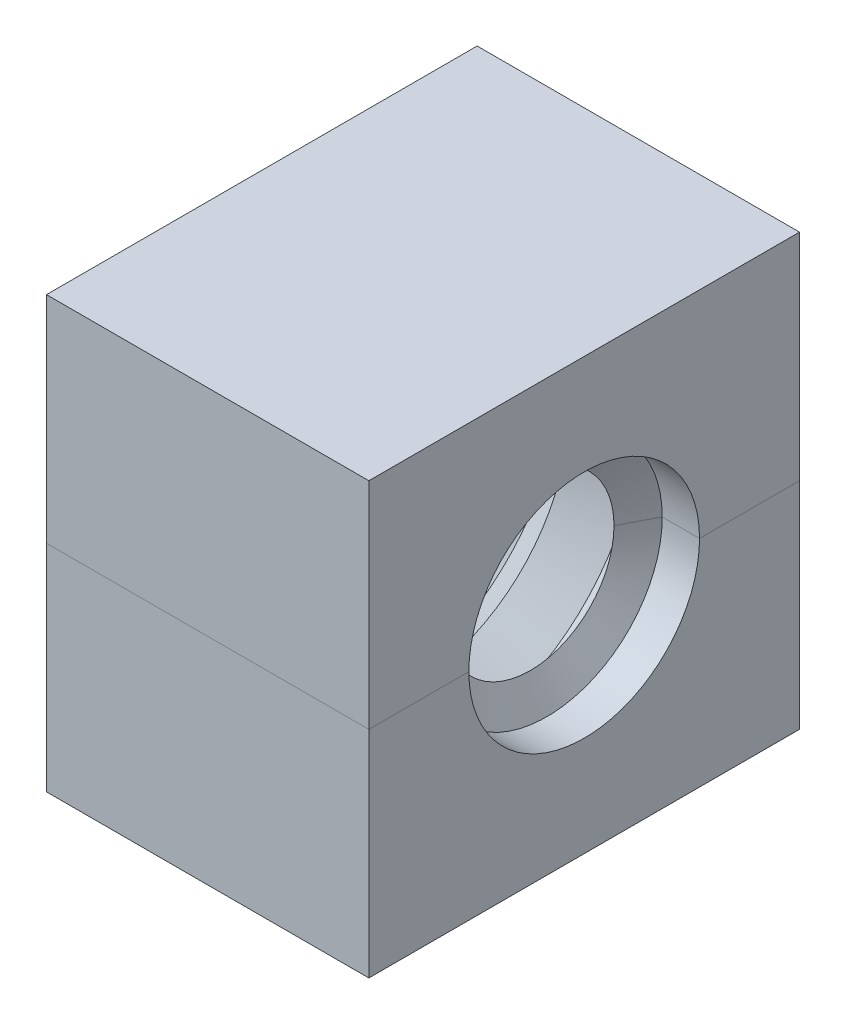
ISO-10303-21;
HEADER;
FILE_DESCRIPTION(('STEP AP214'),'2;1');
FILE_NAME('part.step','',(''),(''),'','','');
FILE_SCHEMA(('AUTOMOTIVE_DESIGN { 1 0 10303 214 1 1 1 1 }'));
ENDSEC;
DATA;
#1=APPLICATION_CONTEXT('core data for automotive mechanical design processes');
#2=APPLICATION_PROTOCOL_DEFINITION('international standard','automotive_design',2000,#1);
#3=PRODUCT_CONTEXT('',#1,'mechanical');
#4=PRODUCT('Part','Part','',(#3));
#5=PRODUCT_RELATED_PRODUCT_CATEGORY('part','',(#4));
#6=PRODUCT_DEFINITION_FORMATION('','',#4);
#7=PRODUCT_DEFINITION_CONTEXT('part definition',#1,'design');
#8=PRODUCT_DEFINITION('design','',#6,#7);
#9=PRODUCT_DEFINITION_SHAPE('','',#8);
#10=(LENGTH_UNIT() NAMED_UNIT(*) SI_UNIT(.MILLI.,.METRE.));
#11=(NAMED_UNIT(*) PLANE_ANGLE_UNIT() SI_UNIT($,.RADIAN.));
#12=(NAMED_UNIT(*) SI_UNIT($,.STERADIAN.) SOLID_ANGLE_UNIT());
#13=UNCERTAINTY_MEASURE_WITH_UNIT(LENGTH_MEASURE(1.E-05),#10,'distance_accuracy_value','');
#14=(GEOMETRIC_REPRESENTATION_CONTEXT(3) GLOBAL_UNCERTAINTY_ASSIGNED_CONTEXT((#13)) GLOBAL_UNIT_ASSIGNED_CONTEXT((#10,
#11,#12)) REPRESENTATION_CONTEXT('',''));
#15=CARTESIAN_POINT('',(0.,0.,0.));
#16=DIRECTION('',(0.,0.,1.));
#17=DIRECTION('',(1.,0.,0.));
#18=AXIS2_PLACEMENT_3D('',#15,#16,#17);
#19=CARTESIAN_POINT('',(0.,-12.7363589291602,0.));
#20=DIRECTION('',(0.,1.,0.));
#21=DIRECTION('',(0.,0.,1.));
#22=AXIS2_PLACEMENT_3D('',#19,#20,#21);
#23=PLANE('',#22);
#24=DIRECTION('',(1.,0.,0.));
#25=VECTOR('',#24,1.);
#26=CARTESIAN_POINT('',(7.7590975124216,-12.7363589291602,-15.));
#27=LINE('',#26,#25);
#28=CARTESIAN_POINT('',(-4.98108073090918,-12.7363589291602,-15.));
#29=VERTEX_POINT('',#28);
#30=CARTESIAN_POINT('',(-9.83041243256664,-12.7363589291602,-15.));
#31=VERTEX_POINT('',#30);
#32=EDGE_CURVE('E215',#29,#31,#27,.F.);
#33=ORIENTED_EDGE('',*,*,#32,.F.);
#34=DIRECTION('',(0.,0.,-1.));
#35=VECTOR('',#34,1.);
#36=CARTESIAN_POINT('',(-4.98108073090918,-12.7363589291602,0.));
#37=LINE('',#36,#35);
#38=CARTESIAN_POINT('',(-4.98108073090918,-12.7363589291602,-28.));
#39=VERTEX_POINT('',#38);
#40=EDGE_CURVE('E168',#29,#39,#37,.T.);
#41=ORIENTED_EDGE('',*,*,#40,.T.);
#42=DIRECTION('',(1.,0.,0.));
#43=VECTOR('',#42,1.);
#44=CARTESIAN_POINT('',(-50.,-12.7363589291602,-28.));
#45=LINE('',#44,#43);
#46=CARTESIAN_POINT('',(-46.9,-12.7363589291602,-28.));
#47=VERTEX_POINT('',#46);
#48=EDGE_CURVE('E167',#47,#39,#45,.T.);
#49=ORIENTED_EDGE('',*,*,#48,.F.);
#50=DIRECTION('',(0.,0.,1.));
#51=VECTOR('',#50,1.);
#52=CARTESIAN_POINT('',(-46.9,-12.7363589291602,5.91789546218049));
#53=LINE('',#52,#51);
#54=CARTESIAN_POINT('',(-46.9,-12.7363589291602,-25.));
#55=VERTEX_POINT('',#54);
#56=EDGE_CURVE('E148',#47,#55,#53,.T.);
#57=ORIENTED_EDGE('',*,*,#56,.T.);
#58=DIRECTION('',(1.,0.,0.));
#59=VECTOR('',#58,1.);
#60=CARTESIAN_POINT('',(7.7590975124216,-12.7363589291602,-25.));
#61=LINE('',#60,#59);
#62=CARTESIAN_POINT('',(-42.6897877664927,-12.7363589291603,-25.));
#63=VERTEX_POINT('',#62);
#64=EDGE_CURVE('E154',#63,#55,#61,.F.);
#65=ORIENTED_EDGE('',*,*,#64,.F.);
#66=DIRECTION('',(-0.757802500204729,0.,-0.652484000327565));
#67=VECTOR('',#66,1.);
#68=CARTESIAN_POINT('',(-13.6544972526912,-12.7363589291602,0.));
#69=LINE('',#68,#67);
#70=CARTESIAN_POINT('',(-37.6897877664927,-12.7363589291602,-20.6948941171922));
#71=VERTEX_POINT('',#70);
#72=EDGE_CURVE('E257',#71,#63,#69,.T.);
#73=ORIENTED_EDGE('',*,*,#72,.F.);
#74=DIRECTION('',(-0.757802500204728,0.,0.652484000327566));
#75=VECTOR('',#74,1.);
#76=CARTESIAN_POINT('',(-61.7250782802942,-12.7363589291602,0.));
#77=LINE('',#76,#75);
#78=CARTESIAN_POINT('',(-32.6897877664927,-12.7363589291602,-25.));
#79=VERTEX_POINT('',#78);
#80=EDGE_CURVE('E259',#79,#71,#77,.T.);
#81=ORIENTED_EDGE('',*,*,#80,.F.);
#82=DIRECTION('',(-0.757802500204728,0.,-0.652484000327566));
#83=VECTOR('',#82,1.);
#84=CARTESIAN_POINT('',(-3.65449725269126,-12.7363589291602,0.));
#85=LINE('',#84,#83);
#86=CARTESIAN_POINT('',(-27.6897877664927,-12.7363589291602,-20.6948941171922));
#87=VERTEX_POINT('',#86);
#88=EDGE_CURVE('E266',#87,#79,#85,.T.);
#89=ORIENTED_EDGE('',*,*,#88,.F.);
#90=DIRECTION('',(-0.757802500204728,0.,0.652484000327566));
#91=VECTOR('',#90,1.);
#92=CARTESIAN_POINT('',(-51.7250782802941,-12.7363589291602,0.));
#93=LINE('',#92,#91);
#94=CARTESIAN_POINT('',(-22.6897877664927,-12.7363589291602,-25.));
#95=VERTEX_POINT('',#94);
#96=EDGE_CURVE('E269',#95,#87,#93,.T.);
#97=ORIENTED_EDGE('',*,*,#96,.F.);
#98=CARTESIAN_POINT('',(-22.6897877664927,-12.7363589291602,-25.));
#99=CARTESIAN_POINT('',(-19.9348326579527,-12.7363589291602,-24.0792000683215));
#100=CARTESIAN_POINT('',(-17.4436232589525,-12.7363589291602,-22.4393096665836));
#101=CARTESIAN_POINT('',(-13.9498380100244,-12.7363589291602,-16.5030001450915));
#102=CARTESIAN_POINT('',(-13.2180776216996,-12.7363589291602,-15.5349248227247));
#103=CARTESIAN_POINT('',(-11.9810807309092,-12.7363589291602,-10.8777948967174));
#104=B_SPLINE_CURVE_WITH_KNOTS('',3,(#98,#99,#100,#101,#102,#103),.UNSPECIFIED.,.F.,.F.,(4,1,1,
4),(0.,0.4140263855918,0.5140263855918,1.),.UNSPECIFIED.);
#105=CARTESIAN_POINT('',(-11.9810807309092,-12.7363589291602,-10.8777948967174));
#106=VERTEX_POINT('',#105);
#107=EDGE_CURVE('E220',#106,#95,#104,.F.);
#108=ORIENTED_EDGE('',*,*,#107,.F.);
#109=DIRECTION('',(-0.462557992065755,0.,0.886589027665071));
#110=VECTOR('',#109,1.);
#111=CARTESIAN_POINT('',(-17.6563268805034,-12.7363589291602,0.));
#112=LINE('',#111,#110);
#113=EDGE_CURVE('E207',#31,#106,#112,.T.);
#114=ORIENTED_EDGE('',*,*,#113,.F.);
#115=EDGE_LOOP('',(#33,#41,#49,#57,#65,#73,#81,#89,#97,#108,#114));
#116=FACE_BOUND('',#115,.T.);
#117=ADVANCED_FACE('F44',(#116),#23,.T.);
#118=DIRECTION('',(1.,0.,0.));
#119=VECTOR('',#118,1.);
#120=CARTESIAN_POINT('',(7.7590975124216,-12.7363589291602,15.));
#121=LINE('',#120,#119);
#122=CARTESIAN_POINT('',(-9.83041243256664,-12.7363589291602,15.));
#123=VERTEX_POINT('',#122);
#124=CARTESIAN_POINT('',(-4.98108073090918,-12.7363589291602,15.));
#125=VERTEX_POINT('',#124);
#126=EDGE_CURVE('E213',#123,#125,#121,.T.);
#127=ORIENTED_EDGE('',*,*,#126,.F.);
#128=DIRECTION('',(0.462557992065755,0.,0.886589027665071));
#129=VECTOR('',#128,1.);
#130=CARTESIAN_POINT('',(-17.6563268805034,-12.7363589291602,0.));
#131=LINE('',#130,#129);
#132=CARTESIAN_POINT('',(-11.9810807309092,-12.7363589291602,10.8777948967174));
#133=VERTEX_POINT('',#132);
#134=EDGE_CURVE('E209',#133,#123,#131,.T.);
#135=ORIENTED_EDGE('',*,*,#134,.F.);
#136=CARTESIAN_POINT('',(-22.6897877664927,-12.7363589291602,25.));
#137=CARTESIAN_POINT('',(-19.9348326579527,-12.7363589291602,24.0792000683215));
#138=CARTESIAN_POINT('',(-17.4436232589525,-12.7363589291602,22.4393096665836));
#139=CARTESIAN_POINT('',(-13.9498380100244,-12.7363589291602,16.5030001450915));
#140=CARTESIAN_POINT('',(-13.2180776216996,-12.7363589291602,15.5349248227247));
#141=CARTESIAN_POINT('',(-11.9810807309092,-12.7363589291602,10.8777948967174));
#142=B_SPLINE_CURVE_WITH_KNOTS('',3,(#136,#137,#138,#139,#140,#141),.UNSPECIFIED.,.F.,.F.,(4,1,
1,4),(0.,0.4140263855918,0.5140263855918,1.),.UNSPECIFIED.);
#143=CARTESIAN_POINT('',(-22.6897877664927,-12.7363589291602,25.));
#144=VERTEX_POINT('',#143);
#145=EDGE_CURVE('E227',#144,#133,#142,.T.);
#146=ORIENTED_EDGE('',*,*,#145,.F.);
#147=DIRECTION('',(0.757802500204728,0.,0.652484000327566));
#148=VECTOR('',#147,1.);
#149=CARTESIAN_POINT('',(-51.7250782802941,-12.7363589291602,0.));
#150=LINE('',#149,#148);
#151=CARTESIAN_POINT('',(-27.6897877664927,-12.7363589291602,20.6948941171922));
#152=VERTEX_POINT('',#151);
#153=EDGE_CURVE('E272',#152,#144,#150,.T.);
#154=ORIENTED_EDGE('',*,*,#153,.F.);
#155=DIRECTION('',(0.757802500204728,0.,-0.652484000327566));
#156=VECTOR('',#155,1.);
#157=CARTESIAN_POINT('',(-3.65449725269126,-12.7363589291602,0.));
#158=LINE('',#157,#156);
#159=CARTESIAN_POINT('',(-32.6897877664927,-12.7363589291602,25.));
#160=VERTEX_POINT('',#159);
#161=EDGE_CURVE('E264',#160,#152,#158,.T.);
#162=ORIENTED_EDGE('',*,*,#161,.F.);
#163=DIRECTION('',(0.757802500204728,0.,0.652484000327566));
#164=VECTOR('',#163,1.);
#165=CARTESIAN_POINT('',(-61.7250782802942,-12.7363589291602,0.));
#166=LINE('',#165,#164);
#167=CARTESIAN_POINT('',(-37.6897877664927,-12.7363589291602,20.6948941171922));
#168=VERTEX_POINT('',#167);
#169=EDGE_CURVE('E262',#168,#160,#166,.T.);
#170=ORIENTED_EDGE('',*,*,#169,.F.);
#171=DIRECTION('',(0.757802500204729,0.,-0.652484000327565));
#172=VECTOR('',#171,1.);
#173=CARTESIAN_POINT('',(-13.6544972526912,-12.7363589291602,0.));
#174=LINE('',#173,#172);
#175=CARTESIAN_POINT('',(-42.6897877664927,-12.7363589291603,25.));
#176=VERTEX_POINT('',#175);
#177=EDGE_CURVE('E255',#176,#168,#174,.T.);
#178=ORIENTED_EDGE('',*,*,#177,.F.);
#179=DIRECTION('',(1.,0.,0.));
#180=VECTOR('',#179,1.);
#181=CARTESIAN_POINT('',(7.7590975124216,-12.7363589291602,25.));
#182=LINE('',#181,#180);
#183=CARTESIAN_POINT('',(-46.9,-12.7363589291602,25.));
#184=VERTEX_POINT('',#183);
#185=EDGE_CURVE('E162',#184,#176,#182,.T.);
#186=ORIENTED_EDGE('',*,*,#185,.F.);
#187=CARTESIAN_POINT('',(-46.9,-12.7363589291602,28.));
#188=VERTEX_POINT('',#187);
#189=EDGE_CURVE('E150',#184,#188,#53,.T.);
#190=ORIENTED_EDGE('',*,*,#189,.T.);
#191=DIRECTION('',(-1.,0.,0.));
#192=VECTOR('',#191,1.);
#193=CARTESIAN_POINT('',(-50.,-12.7363589291602,28.));
#194=LINE('',#193,#192);
#195=CARTESIAN_POINT('',(-4.98108073090918,-12.7363589291602,28.));
#196=VERTEX_POINT('',#195);
#197=EDGE_CURVE('E217',#196,#188,#194,.T.);
#198=ORIENTED_EDGE('',*,*,#197,.F.);
#199=EDGE_CURVE('E170',#196,#125,#37,.T.);
#200=ORIENTED_EDGE('',*,*,#199,.T.);
#201=EDGE_LOOP('',(#127,#135,#146,#154,#162,#170,#178,#186,#190,#198,#200));
#202=FACE_BOUND('',#201,.T.);
#203=ADVANCED_FACE('F241',(#202),#23,.T.);
#204=CARTESIAN_POINT('',(-22.6897877664927,-37.7363589291602,0.));
#205=CARTESIAN_POINT('',(-19.9348326579527,-36.8155589974817,0.));
#206=CARTESIAN_POINT('',(-17.4436232589525,-35.1756685957439,0.));
#207=CARTESIAN_POINT('',(-13.9498380100244,-29.2393590742518,0.));
#208=CARTESIAN_POINT('',(-13.2180776216996,-28.271283751885,0.));
#209=CARTESIAN_POINT('',(-11.9810807309092,-23.6141538258777,0.));
#210=B_SPLINE_CURVE_WITH_KNOTS('',3,(#204,#205,#206,#207,#208,#209),.UNSPECIFIED.,.F.,.F.,(4,1,
1,4),(0.,0.4140263855918,0.5140263855918,1.),.UNSPECIFIED.);
#211=CARTESIAN_POINT('',(7.7590975124216,-12.7363589291602,0.));
#212=DIRECTION('',(1.,0.,0.));
#213=AXIS1_PLACEMENT('',#211,#212);
#214=SURFACE_OF_REVOLUTION('',#210,#213);
#215=CARTESIAN_POINT('',(-22.6897877664927,-12.7363589291602,0.));
#216=DIRECTION('',(1.,0.,0.));
#217=DIRECTION('',(0.,1.,0.));
#218=AXIS2_PLACEMENT_3D('',#215,#216,#217);
#219=CIRCLE('',#218,25.);
#220=EDGE_CURVE('E194',#144,#95,#219,.T.);
#221=ORIENTED_EDGE('',*,*,#220,.F.);
#222=ORIENTED_EDGE('',*,*,#145,.T.);
#223=CARTESIAN_POINT('',(-11.9810807309092,-12.7363589291602,0.));
#224=DIRECTION('',(1.,0.,0.));
#225=DIRECTION('',(0.,1.,0.));
#226=AXIS2_PLACEMENT_3D('',#223,#224,#225);
#227=CIRCLE('',#226,10.8777948967174);
#228=EDGE_CURVE('E197',#133,#106,#227,.T.);
#229=ORIENTED_EDGE('',*,*,#228,.T.);
#230=ORIENTED_EDGE('',*,*,#107,.T.);
#231=EDGE_LOOP('',(#221,#222,#229,#230));
#232=FACE_BOUND('',#231,.T.);
#233=ADVANCED_FACE('F286',(#232),#214,.F.);
#234=CARTESIAN_POINT('',(-27.6897877664927,-12.7363589291602,0.));
#235=DIRECTION('',(1.,0.,0.));
#236=DIRECTION('',(0.,1.,0.));
#237=AXIS2_PLACEMENT_3D('',#234,#235,#236);
#238=CONICAL_SURFACE('',#237,20.6948941171922,0.71085772924938);
#239=CARTESIAN_POINT('',(-27.6897877664927,-12.7363589291602,0.));
#240=DIRECTION('',(1.,0.,0.));
#241=DIRECTION('',(0.,1.,0.));
#242=AXIS2_PLACEMENT_3D('',#239,#240,#241);
#243=CIRCLE('',#242,20.6948941171922);
#244=EDGE_CURVE('E191',#152,#87,#243,.T.);
#245=ORIENTED_EDGE('',*,*,#244,.F.);
#246=ORIENTED_EDGE('',*,*,#153,.T.);
#247=ORIENTED_EDGE('',*,*,#220,.T.);
#248=ORIENTED_EDGE('',*,*,#96,.T.);
#249=EDGE_LOOP('',(#245,#246,#247,#248));
#250=FACE_BOUND('',#249,.T.);
#251=ADVANCED_FACE('F288',(#250),#238,.F.);
#252=CARTESIAN_POINT('',(-32.6897877664927,-12.7363589291602,0.));
#253=DIRECTION('',(-1.,0.,0.));
#254=DIRECTION('',(0.,-1.,0.));
#255=AXIS2_PLACEMENT_3D('',#252,#253,#254);
#256=CONICAL_SURFACE('',#255,25.,0.71085772924938);
#257=ORIENTED_EDGE('',*,*,#244,.T.);
#258=ORIENTED_EDGE('',*,*,#88,.T.);
#259=CARTESIAN_POINT('',(-32.6897877664927,-12.7363589291602,0.));
#260=DIRECTION('',(1.,0.,0.));
#261=DIRECTION('',(0.,1.,0.));
#262=AXIS2_PLACEMENT_3D('',#259,#260,#261);
#263=CIRCLE('',#262,25.);
#264=EDGE_CURVE('E188',#160,#79,#263,.T.);
#265=ORIENTED_EDGE('',*,*,#264,.F.);
#266=ORIENTED_EDGE('',*,*,#161,.T.);
#267=EDGE_LOOP('',(#257,#258,#265,#266));
#268=FACE_BOUND('',#267,.T.);
#269=ADVANCED_FACE('F294',(#268),#256,.F.);
#270=CARTESIAN_POINT('',(-37.6897877664927,-12.7363589291602,0.));
#271=DIRECTION('',(1.,0.,0.));
#272=DIRECTION('',(0.,1.,0.));
#273=AXIS2_PLACEMENT_3D('',#270,#271,#272);
#274=CONICAL_SURFACE('',#273,20.6948941171922,0.710857729249379);
#275=CARTESIAN_POINT('',(-37.6897877664927,-12.7363589291602,0.));
#276=DIRECTION('',(1.,0.,0.));
#277=DIRECTION('',(0.,1.,0.));
#278=AXIS2_PLACEMENT_3D('',#275,#276,#277);
#279=CIRCLE('',#278,20.6948941171922);
#280=EDGE_CURVE('E185',#168,#71,#279,.T.);
#281=ORIENTED_EDGE('',*,*,#280,.F.);
#282=ORIENTED_EDGE('',*,*,#169,.T.);
#283=ORIENTED_EDGE('',*,*,#264,.T.);
#284=ORIENTED_EDGE('',*,*,#80,.T.);
#285=EDGE_LOOP('',(#281,#282,#283,#284));
#286=FACE_BOUND('',#285,.T.);
#287=ADVANCED_FACE('F301',(#286),#274,.F.);
#288=CARTESIAN_POINT('',(-42.6897877664927,-12.7363589291603,0.));
#289=DIRECTION('',(-1.,0.,0.));
#290=DIRECTION('',(0.,-1.,0.));
#291=AXIS2_PLACEMENT_3D('',#288,#289,#290);
#292=CONICAL_SURFACE('',#291,25.,0.710857729249379);
#293=ORIENTED_EDGE('',*,*,#280,.T.);
#294=ORIENTED_EDGE('',*,*,#72,.T.);
#295=CARTESIAN_POINT('',(-42.6897877664927,-12.7363589291603,0.));
#296=DIRECTION('',(1.,0.,0.));
#297=DIRECTION('',(0.,1.,0.));
#298=AXIS2_PLACEMENT_3D('',#295,#296,#297);
#299=CIRCLE('',#298,25.);
#300=EDGE_CURVE('E159',#176,#63,#299,.T.);
#301=ORIENTED_EDGE('',*,*,#300,.F.);
#302=ORIENTED_EDGE('',*,*,#177,.T.);
#303=EDGE_LOOP('',(#293,#294,#301,#302));
#304=FACE_BOUND('',#303,.T.);
#305=ADVANCED_FACE('F305',(#304),#292,.F.);
#306=CARTESIAN_POINT('',(7.7590975124216,-12.7363589291602,0.));
#307=DIRECTION('',(1.,0.,0.));
#308=DIRECTION('',(0.,1.,0.));
#309=AXIS2_PLACEMENT_3D('',#306,#307,#308);
#310=CYLINDRICAL_SURFACE('',#309,25.);
#311=CARTESIAN_POINT('',(-46.9,-12.7363589291603,0.));
#312=DIRECTION('',(1.,0.,0.));
#313=DIRECTION('',(0.,0.,-1.));
#314=AXIS2_PLACEMENT_3D('',#311,#312,#313);
#315=CIRCLE('',#314,25.);
#316=EDGE_CURVE('E144',#184,#55,#315,.T.);
#317=ORIENTED_EDGE('',*,*,#316,.F.);
#318=ORIENTED_EDGE('',*,*,#185,.T.);
#319=ORIENTED_EDGE('',*,*,#300,.T.);
#320=ORIENTED_EDGE('',*,*,#64,.T.);
#321=EDGE_LOOP('',(#317,#318,#319,#320));
#322=FACE_BOUND('',#321,.T.);
#323=ADVANCED_FACE('F157',(#322),#310,.F.);
#324=CARTESIAN_POINT('',(-50.,15.2636410708398,28.));
#325=DIRECTION('',(0.,0.,1.));
#326=DIRECTION('',(0.,-1.,0.));
#327=AXIS2_PLACEMENT_3D('',#324,#325,#326);
#328=PLANE('',#327);
#329=DIRECTION('',(0.,-1.,0.));
#330=VECTOR('',#329,1.);
#331=CARTESIAN_POINT('',(-4.98108073090918,15.2636410708398,28.));
#332=LINE('',#331,#330);
#333=CARTESIAN_POINT('',(-4.98108073090917,-40.7363589291602,28.));
#334=VERTEX_POINT('',#333);
#335=EDGE_CURVE('E62',#196,#334,#332,.T.);
#336=ORIENTED_EDGE('',*,*,#335,.F.);
#337=ORIENTED_EDGE('',*,*,#197,.T.);
#338=DIRECTION('',(0.,1.,0.));
#339=VECTOR('',#338,1.);
#340=CARTESIAN_POINT('',(-46.9,15.2636410708398,28.));
#341=LINE('',#340,#339);
#342=CARTESIAN_POINT('',(-46.9,-40.7363589291602,28.));
#343=VERTEX_POINT('',#342);
#344=EDGE_CURVE('E176',#343,#188,#341,.T.);
#345=ORIENTED_EDGE('',*,*,#344,.F.);
#346=DIRECTION('',(1.,0.,0.));
#347=VECTOR('',#346,1.);
#348=CARTESIAN_POINT('',(-50.,-40.7363589291602,28.));
#349=LINE('',#348,#347);
#350=EDGE_CURVE('E178',#343,#334,#349,.T.);
#351=ORIENTED_EDGE('',*,*,#350,.T.);
#352=EDGE_LOOP('',(#336,#337,#345,#351));
#353=FACE_BOUND('',#352,.T.);
#354=ADVANCED_FACE('F244',(#353),#328,.T.);
#355=CARTESIAN_POINT('',(-50.,-40.7363589291602,28.));
#356=DIRECTION('',(0.,-1.,0.));
#357=DIRECTION('',(0.,0.,-1.));
#358=AXIS2_PLACEMENT_3D('',#355,#356,#357);
#359=PLANE('',#358);
#360=DIRECTION('',(0.,0.,1.));
#361=VECTOR('',#360,1.);
#362=CARTESIAN_POINT('',(-46.9,-40.7363589291602,28.));
#363=LINE('',#362,#361);
#364=CARTESIAN_POINT('',(-46.9,-40.7363589291602,-28.));
#365=VERTEX_POINT('',#364);
#366=EDGE_CURVE('E175',#365,#343,#363,.T.);
#367=ORIENTED_EDGE('',*,*,#366,.F.);
#368=DIRECTION('',(1.,0.,0.));
#369=VECTOR('',#368,1.);
#370=CARTESIAN_POINT('',(-50.,-40.7363589291602,-28.));
#371=LINE('',#370,#369);
#372=CARTESIAN_POINT('',(-4.98108073090917,-40.7363589291602,-28.));
#373=VERTEX_POINT('',#372);
#374=EDGE_CURVE('E70',#365,#373,#371,.T.);
#375=ORIENTED_EDGE('',*,*,#374,.T.);
#376=DIRECTION('',(0.,0.,-1.));
#377=VECTOR('',#376,1.);
#378=CARTESIAN_POINT('',(-4.98108073090917,-40.7363589291602,28.));
#379=LINE('',#378,#377);
#380=EDGE_CURVE('E181',#334,#373,#379,.T.);
#381=ORIENTED_EDGE('',*,*,#380,.F.);
#382=ORIENTED_EDGE('',*,*,#350,.F.);
#383=EDGE_LOOP('',(#367,#375,#381,#382));
#384=FACE_BOUND('',#383,.T.);
#385=ADVANCED_FACE('F248',(#384),#359,.T.);
#386=CARTESIAN_POINT('',(-50.,15.2636410708398,-28.));
#387=DIRECTION('',(0.,0.,-1.));
#388=DIRECTION('',(0.,1.,0.));
#389=AXIS2_PLACEMENT_3D('',#386,#387,#388);
#390=PLANE('',#389);
#391=DIRECTION('',(0.,-1.,0.));
#392=VECTOR('',#391,1.);
#393=CARTESIAN_POINT('',(-46.9,15.2636410708398,-28.));
#394=LINE('',#393,#392);
#395=EDGE_CURVE('E153',#47,#365,#394,.T.);
#396=ORIENTED_EDGE('',*,*,#395,.F.);
#397=ORIENTED_EDGE('',*,*,#48,.T.);
#398=DIRECTION('',(0.,1.,0.));
#399=VECTOR('',#398,1.);
#400=CARTESIAN_POINT('',(-4.98108073090918,15.2636410708398,-28.));
#401=LINE('',#400,#399);
#402=EDGE_CURVE('E180',#373,#39,#401,.T.);
#403=ORIENTED_EDGE('',*,*,#402,.F.);
#404=ORIENTED_EDGE('',*,*,#374,.F.);
#405=EDGE_LOOP('',(#396,#397,#403,#404));
#406=FACE_BOUND('',#405,.T.);
#407=ADVANCED_FACE('F276',(#406),#390,.T.);
#408=CARTESIAN_POINT('',(-46.9,-12.7363589291602,5.91789546218049));
#409=DIRECTION('',(1.,0.,0.));
#410=DIRECTION('',(0.,0.,-1.));
#411=AXIS2_PLACEMENT_3D('',#408,#409,#410);
#412=PLANE('',#411);
#413=ORIENTED_EDGE('',*,*,#56,.F.);
#414=ORIENTED_EDGE('',*,*,#395,.T.);
#415=ORIENTED_EDGE('',*,*,#366,.T.);
#416=ORIENTED_EDGE('',*,*,#344,.T.);
#417=ORIENTED_EDGE('',*,*,#189,.F.);
#418=ORIENTED_EDGE('',*,*,#316,.T.);
#419=EDGE_LOOP('',(#413,#414,#415,#416,#417,#418));
#420=FACE_BOUND('',#419,.T.);
#421=ADVANCED_FACE('F146',(#420),#412,.F.);
#422=CARTESIAN_POINT('',(-11.9810807309092,-12.7363589291602,0.));
#423=DIRECTION('',(1.,0.,0.));
#424=DIRECTION('',(0.,1.,0.));
#425=AXIS2_PLACEMENT_3D('',#422,#423,#424);
#426=CONICAL_SURFACE('',#425,10.8777948967174,1.08991808646799);
#427=ORIENTED_EDGE('',*,*,#228,.F.);
#428=ORIENTED_EDGE('',*,*,#134,.T.);
#429=CARTESIAN_POINT('',(-9.83041243256664,-12.7363589291602,0.));
#430=DIRECTION('',(1.,0.,0.));
#431=DIRECTION('',(0.,1.,0.));
#432=AXIS2_PLACEMENT_3D('',#429,#430,#431);
#433=CIRCLE('',#432,15.);
#434=EDGE_CURVE('E55',#123,#31,#433,.T.);
#435=ORIENTED_EDGE('',*,*,#434,.T.);
#436=ORIENTED_EDGE('',*,*,#113,.T.);
#437=EDGE_LOOP('',(#427,#428,#435,#436));
#438=FACE_BOUND('',#437,.T.);
#439=ADVANCED_FACE('F205',(#438),#426,.F.);
#440=CARTESIAN_POINT('',(7.7590975124216,-12.7363589291602,0.));
#441=DIRECTION('',(1.,0.,0.));
#442=DIRECTION('',(0.,1.,0.));
#443=AXIS2_PLACEMENT_3D('',#440,#441,#442);
#444=CYLINDRICAL_SURFACE('',#443,15.);
#445=ORIENTED_EDGE('',*,*,#434,.F.);
#446=ORIENTED_EDGE('',*,*,#126,.T.);
#447=CARTESIAN_POINT('',(-4.98108073090918,-12.7363589291602,0.));
#448=DIRECTION('',(1.,0.,0.));
#449=DIRECTION('',(0.,1.,0.));
#450=AXIS2_PLACEMENT_3D('',#447,#448,#449);
#451=CIRCLE('',#450,15.);
#452=EDGE_CURVE('E12',#125,#29,#451,.T.);
#453=ORIENTED_EDGE('',*,*,#452,.T.);
#454=ORIENTED_EDGE('',*,*,#32,.T.);
#455=EDGE_LOOP('',(#445,#446,#453,#454));
#456=FACE_BOUND('',#455,.T.);
#457=ADVANCED_FACE('F212',(#456),#444,.F.);
#458=CARTESIAN_POINT('',(-4.98108073090918,2.26364107083975,0.));
#459=DIRECTION('',(-1.,0.,0.));
#460=DIRECTION('',(0.,-1.,0.));
#461=AXIS2_PLACEMENT_3D('',#458,#459,#460);
#462=PLANE('',#461);
#463=ORIENTED_EDGE('',*,*,#199,.F.);
#464=ORIENTED_EDGE('',*,*,#335,.T.);
#465=ORIENTED_EDGE('',*,*,#380,.T.);
#466=ORIENTED_EDGE('',*,*,#402,.T.);
#467=ORIENTED_EDGE('',*,*,#40,.F.);
#468=ORIENTED_EDGE('',*,*,#452,.F.);
#469=EDGE_LOOP('',(#463,#464,#465,#466,#467,#468));
#470=FACE_BOUND('',#469,.T.);
#471=ADVANCED_FACE('F46',(#470),#462,.F.);
#472=CLOSED_SHELL('',(#117,#203,#233,#251,#269,#287,#305,#323,#354,#385,#407,#421,#439,#457,#471));
#473=MANIFOLD_SOLID_BREP('B2',#472);
#474=CARTESIAN_POINT('',(0.,-12.7363589291602,0.));
#475=DIRECTION('',(0.,1.,0.));
#476=DIRECTION('',(0.,0.,1.));
#477=AXIS2_PLACEMENT_3D('',#474,#475,#476);
#478=PLANE('',#477);
#479=DIRECTION('',(1.,0.,0.));
#480=VECTOR('',#479,1.);
#481=CARTESIAN_POINT('',(7.7590975124216,-12.7363589291602,-15.));
#482=LINE('',#481,#480);
#483=CARTESIAN_POINT('',(-4.98108073090918,-12.7363589291602,-15.));
#484=VERTEX_POINT('',#483);
#485=CARTESIAN_POINT('',(-9.83041243256664,-12.7363589291602,-15.));
#486=VERTEX_POINT('',#485);
#487=EDGE_CURVE('E418',#484,#486,#482,.F.);
#488=ORIENTED_EDGE('',*,*,#487,.T.);
#489=DIRECTION('',(-0.462557992065755,0.,0.886589027665071));
#490=VECTOR('',#489,1.);
#491=CARTESIAN_POINT('',(-17.6563268805034,-12.7363589291602,0.));
#492=LINE('',#491,#490);
#493=CARTESIAN_POINT('',(-11.9810807309092,-12.7363589291602,-10.8777948967174));
#494=VERTEX_POINT('',#493);
#495=EDGE_CURVE('E577',#486,#494,#492,.T.);
#496=ORIENTED_EDGE('',*,*,#495,.T.);
#497=CARTESIAN_POINT('',(-22.6897877664927,-12.7363589291602,-25.));
#498=CARTESIAN_POINT('',(-19.9348326579527,-12.7363589291602,-24.0792000683215));
#499=CARTESIAN_POINT('',(-17.4436232589525,-12.7363589291602,-22.4393096665836));
#500=CARTESIAN_POINT('',(-13.9498380100244,-12.7363589291602,-16.5030001450915));
#501=CARTESIAN_POINT('',(-13.2180776216996,-12.7363589291602,-15.5349248227247));
#502=CARTESIAN_POINT('',(-11.9810807309092,-12.7363589291602,-10.8777948967174));
#503=B_SPLINE_CURVE_WITH_KNOTS('',3,(#497,#498,#499,#500,#501,#502),.UNSPECIFIED.,.F.,.F.,(4,1,
1,4),(0.,0.4140263855918,0.5140263855918,1.),.UNSPECIFIED.);
#504=CARTESIAN_POINT('',(-22.6897877664927,-12.7363589291602,-25.));
#505=VERTEX_POINT('',#504);
#506=EDGE_CURVE('E571',#494,#505,#503,.F.);
#507=ORIENTED_EDGE('',*,*,#506,.T.);
#508=DIRECTION('',(-0.757802500204728,0.,0.652484000327566));
#509=VECTOR('',#508,1.);
#510=CARTESIAN_POINT('',(-51.7250782802941,-12.7363589291602,0.));
#511=LINE('',#510,#509);
#512=CARTESIAN_POINT('',(-27.6897877664927,-12.7363589291602,-20.6948941171922));
#513=VERTEX_POINT('',#512);
#514=EDGE_CURVE('E563',#505,#513,#511,.T.);
#515=ORIENTED_EDGE('',*,*,#514,.T.);
#516=DIRECTION('',(-0.757802500204728,0.,-0.652484000327566));
#517=VECTOR('',#516,1.);
#518=CARTESIAN_POINT('',(-3.65449725269126,-12.7363589291602,0.));
#519=LINE('',#518,#517);
#520=CARTESIAN_POINT('',(-32.6897877664927,-12.7363589291602,-25.));
#521=VERTEX_POINT('',#520);
#522=EDGE_CURVE('E559',#513,#521,#519,.T.);
#523=ORIENTED_EDGE('',*,*,#522,.T.);
#524=DIRECTION('',(-0.757802500204728,0.,0.652484000327566));
#525=VECTOR('',#524,1.);
#526=CARTESIAN_POINT('',(-61.7250782802942,-12.7363589291602,0.));
#527=LINE('',#526,#525);
#528=CARTESIAN_POINT('',(-37.6897877664927,-12.7363589291602,-20.6948941171922));
#529=VERTEX_POINT('',#528);
#530=EDGE_CURVE('E555',#521,#529,#527,.T.);
#531=ORIENTED_EDGE('',*,*,#530,.T.);
#532=DIRECTION('',(-0.757802500204729,0.,-0.652484000327565));
#533=VECTOR('',#532,1.);
#534=CARTESIAN_POINT('',(-13.6544972526912,-12.7363589291602,0.));
#535=LINE('',#534,#533);
#536=CARTESIAN_POINT('',(-42.6897877664927,-12.7363589291603,-25.));
#537=VERTEX_POINT('',#536);
#538=EDGE_CURVE('E551',#529,#537,#535,.T.);
#539=ORIENTED_EDGE('',*,*,#538,.T.);
#540=DIRECTION('',(1.,0.,0.));
#541=VECTOR('',#540,1.);
#542=CARTESIAN_POINT('',(7.7590975124216,-12.7363589291602,-25.));
#543=LINE('',#542,#541);
#544=CARTESIAN_POINT('',(-46.9,-12.7363589291602,-25.));
#545=VERTEX_POINT('',#544);
#546=EDGE_CURVE('E42',#537,#545,#543,.F.);
#547=ORIENTED_EDGE('',*,*,#546,.T.);
#548=DIRECTION('',(0.,0.,1.));
#549=VECTOR('',#548,1.);
#550=CARTESIAN_POINT('',(-46.9,-12.7363589291602,5.91789546218049));
#551=LINE('',#550,#549);
#552=CARTESIAN_POINT('',(-46.9,-12.7363589291602,-28.));
#553=VERTEX_POINT('',#552);
#554=EDGE_CURVE('E544',#553,#545,#551,.T.);
#555=ORIENTED_EDGE('',*,*,#554,.F.);
#556=DIRECTION('',(1.,0.,0.));
#557=VECTOR('',#556,1.);
#558=CARTESIAN_POINT('',(-50.,-12.7363589291602,-28.));
#559=LINE('',#558,#557);
#560=CARTESIAN_POINT('',(-4.98108073090918,-12.7363589291602,-28.));
#561=VERTEX_POINT('',#560);
#562=EDGE_CURVE('E564',#553,#561,#559,.T.);
#563=ORIENTED_EDGE('',*,*,#562,.T.);
#564=DIRECTION('',(0.,0.,-1.));
#565=VECTOR('',#564,1.);
#566=CARTESIAN_POINT('',(-4.98108073090918,-12.7363589291602,0.));
#567=LINE('',#566,#565);
#568=EDGE_CURVE('E546',#484,#561,#567,.T.);
#569=ORIENTED_EDGE('',*,*,#568,.F.);
#570=EDGE_LOOP('',(#488,#496,#507,#515,#523,#531,#539,#547,#555,#563,#569));
#571=FACE_BOUND('',#570,.T.);
#572=ADVANCED_FACE('F415',(#571),#478,.F.);
#573=DIRECTION('',(1.,0.,0.));
#574=VECTOR('',#573,1.);
#575=CARTESIAN_POINT('',(7.7590975124216,-12.7363589291602,15.));
#576=LINE('',#575,#574);
#577=CARTESIAN_POINT('',(-9.83041243256664,-12.7363589291602,15.));
#578=VERTEX_POINT('',#577);
#579=CARTESIAN_POINT('',(-4.98108073090918,-12.7363589291602,15.));
#580=VERTEX_POINT('',#579);
#581=EDGE_CURVE('E578',#578,#580,#576,.T.);
#582=ORIENTED_EDGE('',*,*,#581,.T.);
#583=CARTESIAN_POINT('',(-4.98108073090918,-12.7363589291602,28.));
#584=VERTEX_POINT('',#583);
#585=EDGE_CURVE('E548',#584,#580,#567,.T.);
#586=ORIENTED_EDGE('',*,*,#585,.F.);
#587=DIRECTION('',(-1.,0.,0.));
#588=VECTOR('',#587,1.);
#589=CARTESIAN_POINT('',(-50.,-12.7363589291602,28.));
#590=LINE('',#589,#588);
#591=CARTESIAN_POINT('',(-46.9,-12.7363589291602,28.));
#592=VERTEX_POINT('',#591);
#593=EDGE_CURVE('E536',#584,#592,#590,.T.);
#594=ORIENTED_EDGE('',*,*,#593,.T.);
#595=CARTESIAN_POINT('',(-46.9,-12.7363589291602,25.));
#596=VERTEX_POINT('',#595);
#597=EDGE_CURVE('E542',#596,#592,#551,.T.);
#598=ORIENTED_EDGE('',*,*,#597,.F.);
#599=DIRECTION('',(1.,0.,0.));
#600=VECTOR('',#599,1.);
#601=CARTESIAN_POINT('',(7.7590975124216,-12.7363589291602,25.));
#602=LINE('',#601,#600);
#603=CARTESIAN_POINT('',(-42.6897877664927,-12.7363589291603,25.));
#604=VERTEX_POINT('',#603);
#605=EDGE_CURVE('E423',#596,#604,#602,.T.);
#606=ORIENTED_EDGE('',*,*,#605,.T.);
#607=DIRECTION('',(0.757802500204729,0.,-0.652484000327565));
#608=VECTOR('',#607,1.);
#609=CARTESIAN_POINT('',(-13.6544972526912,-12.7363589291602,0.));
#610=LINE('',#609,#608);
#611=CARTESIAN_POINT('',(-37.6897877664927,-12.7363589291602,20.6948941171922));
#612=VERTEX_POINT('',#611);
#613=EDGE_CURVE('E431',#604,#612,#610,.T.);
#614=ORIENTED_EDGE('',*,*,#613,.T.);
#615=DIRECTION('',(0.757802500204728,0.,0.652484000327566));
#616=VECTOR('',#615,1.);
#617=CARTESIAN_POINT('',(-61.7250782802942,-12.7363589291602,0.));
#618=LINE('',#617,#616);
#619=CARTESIAN_POINT('',(-32.6897877664927,-12.7363589291602,25.));
#620=VERTEX_POINT('',#619);
#621=EDGE_CURVE('E552',#612,#620,#618,.T.);
#622=ORIENTED_EDGE('',*,*,#621,.T.);
#623=DIRECTION('',(0.757802500204728,0.,-0.652484000327566));
#624=VECTOR('',#623,1.);
#625=CARTESIAN_POINT('',(-3.65449725269126,-12.7363589291602,0.));
#626=LINE('',#625,#624);
#627=CARTESIAN_POINT('',(-27.6897877664927,-12.7363589291602,20.6948941171922));
#628=VERTEX_POINT('',#627);
#629=EDGE_CURVE('E556',#620,#628,#626,.T.);
#630=ORIENTED_EDGE('',*,*,#629,.T.);
#631=DIRECTION('',(0.757802500204728,0.,0.652484000327566));
#632=VECTOR('',#631,1.);
#633=CARTESIAN_POINT('',(-51.7250782802941,-12.7363589291602,0.));
#634=LINE('',#633,#632);
#635=CARTESIAN_POINT('',(-22.6897877664927,-12.7363589291602,25.));
#636=VERTEX_POINT('',#635);
#637=EDGE_CURVE('E560',#628,#636,#634,.T.);
#638=ORIENTED_EDGE('',*,*,#637,.T.);
#639=CARTESIAN_POINT('',(-22.6897877664927,-12.7363589291602,25.));
#640=CARTESIAN_POINT('',(-19.9348326579527,-12.7363589291602,24.0792000683215));
#641=CARTESIAN_POINT('',(-17.4436232589525,-12.7363589291602,22.4393096665836));
#642=CARTESIAN_POINT('',(-13.9498380100244,-12.7363589291602,16.5030001450915));
#643=CARTESIAN_POINT('',(-13.2180776216996,-12.7363589291602,15.5349248227247));
#644=CARTESIAN_POINT('',(-11.9810807309092,-12.7363589291602,10.8777948967174));
#645=B_SPLINE_CURVE_WITH_KNOTS('',3,(#639,#640,#641,#642,#643,#644),.UNSPECIFIED.,.F.,.F.,(4,1,
1,4),(0.,0.4140263855918,0.5140263855918,1.),.UNSPECIFIED.);
#646=CARTESIAN_POINT('',(-11.9810807309092,-12.7363589291602,10.8777948967174));
#647=VERTEX_POINT('',#646);
#648=EDGE_CURVE('E566',#636,#647,#645,.T.);
#649=ORIENTED_EDGE('',*,*,#648,.T.);
#650=DIRECTION('',(0.462557992065755,0.,0.886589027665071));
#651=VECTOR('',#650,1.);
#652=CARTESIAN_POINT('',(-17.6563268805034,-12.7363589291602,0.));
#653=LINE('',#652,#651);
#654=EDGE_CURVE('E572',#647,#578,#653,.T.);
#655=ORIENTED_EDGE('',*,*,#654,.T.);
#656=EDGE_LOOP('',(#582,#586,#594,#598,#606,#614,#622,#630,#638,#649,#655));
#657=FACE_BOUND('',#656,.T.);
#658=ADVANCED_FACE('F632',(#657),#478,.F.);
#659=CARTESIAN_POINT('',(-22.6897877664927,-37.7363589291602,0.));
#660=CARTESIAN_POINT('',(-19.9348326579527,-36.8155589974817,0.));
#661=CARTESIAN_POINT('',(-17.4436232589525,-35.1756685957439,0.));
#662=CARTESIAN_POINT('',(-13.9498380100244,-29.2393590742518,0.));
#663=CARTESIAN_POINT('',(-13.2180776216996,-28.271283751885,0.));
#664=CARTESIAN_POINT('',(-11.9810807309092,-23.6141538258777,0.));
#665=B_SPLINE_CURVE_WITH_KNOTS('',3,(#659,#660,#661,#662,#663,#664),.UNSPECIFIED.,.F.,.F.,(4,1,
1,4),(0.,0.4140263855918,0.5140263855918,1.),.UNSPECIFIED.);
#666=CARTESIAN_POINT('',(7.7590975124216,-12.7363589291602,0.));
#667=DIRECTION('',(1.,0.,0.));
#668=AXIS1_PLACEMENT('',#666,#667);
#669=SURFACE_OF_REVOLUTION('',#665,#668);
#670=ORIENTED_EDGE('',*,*,#648,.F.);
#671=CARTESIAN_POINT('',(-22.6897877664927,-12.7363589291602,0.));
#672=DIRECTION('',(1.,0.,0.));
#673=DIRECTION('',(0.,1.,0.));
#674=AXIS2_PLACEMENT_3D('',#671,#672,#673);
#675=CIRCLE('',#674,25.);
#676=EDGE_CURVE('E609',#505,#636,#675,.T.);
#677=ORIENTED_EDGE('',*,*,#676,.F.);
#678=ORIENTED_EDGE('',*,*,#506,.F.);
#679=CARTESIAN_POINT('',(-11.9810807309092,-12.7363589291602,0.));
#680=DIRECTION('',(1.,0.,0.));
#681=DIRECTION('',(0.,1.,0.));
#682=AXIS2_PLACEMENT_3D('',#679,#680,#681);
#683=CIRCLE('',#682,10.8777948967174);
#684=EDGE_CURVE('E606',#494,#647,#683,.T.);
#685=ORIENTED_EDGE('',*,*,#684,.T.);
#686=EDGE_LOOP('',(#670,#677,#678,#685));
#687=FACE_BOUND('',#686,.T.);
#688=ADVANCED_FACE('F627',(#687),#669,.F.);
#689=CARTESIAN_POINT('',(-27.6897877664927,-12.7363589291602,0.));
#690=DIRECTION('',(1.,0.,0.));
#691=DIRECTION('',(0.,1.,0.));
#692=AXIS2_PLACEMENT_3D('',#689,#690,#691);
#693=CONICAL_SURFACE('',#692,20.6948941171922,0.71085772924938);
#694=ORIENTED_EDGE('',*,*,#637,.F.);
#695=CARTESIAN_POINT('',(-27.6897877664927,-12.7363589291602,0.));
#696=DIRECTION('',(1.,0.,0.));
#697=DIRECTION('',(0.,1.,0.));
#698=AXIS2_PLACEMENT_3D('',#695,#696,#697);
#699=CIRCLE('',#698,20.6948941171922);
#700=EDGE_CURVE('E613',#513,#628,#699,.T.);
#701=ORIENTED_EDGE('',*,*,#700,.F.);
#702=ORIENTED_EDGE('',*,*,#514,.F.);
#703=ORIENTED_EDGE('',*,*,#676,.T.);
#704=EDGE_LOOP('',(#694,#701,#702,#703));
#705=FACE_BOUND('',#704,.T.);
#706=ADVANCED_FACE('F631',(#705),#693,.F.);
#707=CARTESIAN_POINT('',(-32.6897877664927,-12.7363589291602,0.));
#708=DIRECTION('',(-1.,0.,0.));
#709=DIRECTION('',(0.,-1.,0.));
#710=AXIS2_PLACEMENT_3D('',#707,#708,#709);
#711=CONICAL_SURFACE('',#710,25.,0.71085772924938);
#712=ORIENTED_EDGE('',*,*,#522,.F.);
#713=ORIENTED_EDGE('',*,*,#700,.T.);
#714=ORIENTED_EDGE('',*,*,#629,.F.);
#715=CARTESIAN_POINT('',(-32.6897877664927,-12.7363589291602,0.));
#716=DIRECTION('',(1.,0.,0.));
#717=DIRECTION('',(0.,1.,0.));
#718=AXIS2_PLACEMENT_3D('',#715,#716,#717);
#719=CIRCLE('',#718,25.);
#720=EDGE_CURVE('E674',#521,#620,#719,.T.);
#721=ORIENTED_EDGE('',*,*,#720,.F.);
#722=EDGE_LOOP('',(#712,#713,#714,#721));
#723=FACE_BOUND('',#722,.T.);
#724=ADVANCED_FACE('F683',(#723),#711,.F.);
#725=CARTESIAN_POINT('',(-37.6897877664927,-12.7363589291602,0.));
#726=DIRECTION('',(1.,0.,0.));
#727=DIRECTION('',(0.,1.,0.));
#728=AXIS2_PLACEMENT_3D('',#725,#726,#727);
#729=CONICAL_SURFACE('',#728,20.6948941171922,0.710857729249379);
#730=ORIENTED_EDGE('',*,*,#621,.F.);
#731=CARTESIAN_POINT('',(-37.6897877664927,-12.7363589291602,0.));
#732=DIRECTION('',(1.,0.,0.));
#733=DIRECTION('',(0.,1.,0.));
#734=AXIS2_PLACEMENT_3D('',#731,#732,#733);
#735=CIRCLE('',#734,20.6948941171922);
#736=EDGE_CURVE('E672',#529,#612,#735,.T.);
#737=ORIENTED_EDGE('',*,*,#736,.F.);
#738=ORIENTED_EDGE('',*,*,#530,.F.);
#739=ORIENTED_EDGE('',*,*,#720,.T.);
#740=EDGE_LOOP('',(#730,#737,#738,#739));
#741=FACE_BOUND('',#740,.T.);
#742=ADVANCED_FACE('F688',(#741),#729,.F.);
#743=CARTESIAN_POINT('',(-42.6897877664927,-12.7363589291603,0.));
#744=DIRECTION('',(-1.,0.,0.));
#745=DIRECTION('',(0.,-1.,0.));
#746=AXIS2_PLACEMENT_3D('',#743,#744,#745);
#747=CONICAL_SURFACE('',#746,25.,0.710857729249379);
#748=ORIENTED_EDGE('',*,*,#538,.F.);
#749=ORIENTED_EDGE('',*,*,#736,.T.);
#750=ORIENTED_EDGE('',*,*,#613,.F.);
#751=CARTESIAN_POINT('',(-42.6897877664927,-12.7363589291603,0.));
#752=DIRECTION('',(1.,0.,0.));
#753=DIRECTION('',(0.,1.,0.));
#754=AXIS2_PLACEMENT_3D('',#751,#752,#753);
#755=CIRCLE('',#754,25.);
#756=EDGE_CURVE('E671',#537,#604,#755,.T.);
#757=ORIENTED_EDGE('',*,*,#756,.F.);
#758=EDGE_LOOP('',(#748,#749,#750,#757));
#759=FACE_BOUND('',#758,.T.);
#760=ADVANCED_FACE('F645',(#759),#747,.F.);
#761=CARTESIAN_POINT('',(-50.,15.2636410708398,28.));
#762=DIRECTION('',(0.,1.,0.));
#763=DIRECTION('',(0.,0.,1.));
#764=AXIS2_PLACEMENT_3D('',#761,#762,#763);
#765=PLANE('',#764);
#766=DIRECTION('',(0.,0.,-1.));
#767=VECTOR('',#766,1.);
#768=CARTESIAN_POINT('',(-46.9,15.2636410708398,28.));
#769=LINE('',#768,#767);
#770=CARTESIAN_POINT('',(-46.9,15.2636410708398,28.));
#771=VERTEX_POINT('',#770);
#772=CARTESIAN_POINT('',(-46.9,15.2636410708398,-28.));
#773=VERTEX_POINT('',#772);
#774=EDGE_CURVE('E519',#771,#773,#769,.T.);
#775=ORIENTED_EDGE('',*,*,#774,.F.);
#776=DIRECTION('',(1.,0.,0.));
#777=VECTOR('',#776,1.);
#778=CARTESIAN_POINT('',(-50.,15.2636410708398,28.));
#779=LINE('',#778,#777);
#780=CARTESIAN_POINT('',(-4.98108073090918,15.2636410708398,28.));
#781=VERTEX_POINT('',#780);
#782=EDGE_CURVE('E514',#771,#781,#779,.T.);
#783=ORIENTED_EDGE('',*,*,#782,.T.);
#784=DIRECTION('',(0.,0.,1.));
#785=VECTOR('',#784,1.);
#786=CARTESIAN_POINT('',(-4.98108073090918,15.2636410708398,28.));
#787=LINE('',#786,#785);
#788=CARTESIAN_POINT('',(-4.98108073090918,15.2636410708398,-28.));
#789=VERTEX_POINT('',#788);
#790=EDGE_CURVE('E518',#789,#781,#787,.T.);
#791=ORIENTED_EDGE('',*,*,#790,.F.);
#792=DIRECTION('',(1.,0.,0.));
#793=VECTOR('',#792,1.);
#794=CARTESIAN_POINT('',(-50.,15.2636410708398,-28.));
#795=LINE('',#794,#793);
#796=EDGE_CURVE('E524',#773,#789,#795,.T.);
#797=ORIENTED_EDGE('',*,*,#796,.F.);
#798=EDGE_LOOP('',(#775,#783,#791,#797));
#799=FACE_BOUND('',#798,.T.);
#800=ADVANCED_FACE('F516',(#799),#765,.T.);
#801=CARTESIAN_POINT('',(-50.,15.2636410708398,28.));
#802=DIRECTION('',(0.,0.,1.));
#803=DIRECTION('',(0.,-1.,0.));
#804=AXIS2_PLACEMENT_3D('',#801,#802,#803);
#805=PLANE('',#804);
#806=ORIENTED_EDGE('',*,*,#593,.F.);
#807=DIRECTION('',(0.,-1.,0.));
#808=VECTOR('',#807,1.);
#809=CARTESIAN_POINT('',(-4.98108073090918,15.2636410708398,28.));
#810=LINE('',#809,#808);
#811=EDGE_CURVE('E529',#781,#584,#810,.T.);
#812=ORIENTED_EDGE('',*,*,#811,.F.);
#813=ORIENTED_EDGE('',*,*,#782,.F.);
#814=DIRECTION('',(0.,1.,0.));
#815=VECTOR('',#814,1.);
#816=CARTESIAN_POINT('',(-46.9,15.2636410708398,28.));
#817=LINE('',#816,#815);
#818=EDGE_CURVE('E523',#592,#771,#817,.T.);
#819=ORIENTED_EDGE('',*,*,#818,.F.);
#820=EDGE_LOOP('',(#806,#812,#813,#819));
#821=FACE_BOUND('',#820,.T.);
#822=ADVANCED_FACE('F534',(#821),#805,.T.);
#823=CARTESIAN_POINT('',(7.7590975124216,-12.7363589291602,0.));
#824=DIRECTION('',(1.,0.,0.));
#825=DIRECTION('',(0.,1.,0.));
#826=AXIS2_PLACEMENT_3D('',#823,#824,#825);
#827=CYLINDRICAL_SURFACE('',#826,25.);
#828=ORIENTED_EDGE('',*,*,#605,.F.);
#829=CARTESIAN_POINT('',(-46.9,-12.7363589291603,0.));
#830=DIRECTION('',(1.,0.,0.));
#831=DIRECTION('',(0.,0.,-1.));
#832=AXIS2_PLACEMENT_3D('',#829,#830,#831);
#833=CIRCLE('',#832,25.);
#834=EDGE_CURVE('E545',#545,#596,#833,.T.);
#835=ORIENTED_EDGE('',*,*,#834,.F.);
#836=ORIENTED_EDGE('',*,*,#546,.F.);
#837=ORIENTED_EDGE('',*,*,#756,.T.);
#838=EDGE_LOOP('',(#828,#835,#836,#837));
#839=FACE_BOUND('',#838,.T.);
#840=ADVANCED_FACE('F647',(#839),#827,.F.);
#841=CARTESIAN_POINT('',(-50.,15.2636410708398,-28.));
#842=DIRECTION('',(0.,0.,-1.));
#843=DIRECTION('',(0.,1.,0.));
#844=AXIS2_PLACEMENT_3D('',#841,#842,#843);
#845=PLANE('',#844);
#846=ORIENTED_EDGE('',*,*,#562,.F.);
#847=DIRECTION('',(0.,-1.,0.));
#848=VECTOR('',#847,1.);
#849=CARTESIAN_POINT('',(-46.9,15.2636410708398,-28.));
#850=LINE('',#849,#848);
#851=EDGE_CURVE('E781',#773,#553,#850,.T.);
#852=ORIENTED_EDGE('',*,*,#851,.F.);
#853=ORIENTED_EDGE('',*,*,#796,.T.);
#854=DIRECTION('',(0.,1.,0.));
#855=VECTOR('',#854,1.);
#856=CARTESIAN_POINT('',(-4.98108073090918,15.2636410708398,-28.));
#857=LINE('',#856,#855);
#858=EDGE_CURVE('E531',#561,#789,#857,.T.);
#859=ORIENTED_EDGE('',*,*,#858,.F.);
#860=EDGE_LOOP('',(#846,#852,#853,#859));
#861=FACE_BOUND('',#860,.T.);
#862=ADVANCED_FACE('F648',(#861),#845,.T.);
#863=CARTESIAN_POINT('',(-46.9,-12.7363589291602,5.91789546218049));
#864=DIRECTION('',(1.,0.,0.));
#865=DIRECTION('',(0.,0.,-1.));
#866=AXIS2_PLACEMENT_3D('',#863,#864,#865);
#867=PLANE('',#866);
#868=ORIENTED_EDGE('',*,*,#851,.T.);
#869=ORIENTED_EDGE('',*,*,#554,.T.);
#870=ORIENTED_EDGE('',*,*,#834,.T.);
#871=ORIENTED_EDGE('',*,*,#597,.T.);
#872=ORIENTED_EDGE('',*,*,#818,.T.);
#873=ORIENTED_EDGE('',*,*,#774,.T.);
#874=EDGE_LOOP('',(#868,#869,#870,#871,#872,#873));
#875=FACE_BOUND('',#874,.T.);
#876=ADVANCED_FACE('F637',(#875),#867,.F.);
#877=CARTESIAN_POINT('',(-11.9810807309092,-12.7363589291602,0.));
#878=DIRECTION('',(1.,0.,0.));
#879=DIRECTION('',(0.,1.,0.));
#880=AXIS2_PLACEMENT_3D('',#877,#878,#879);
#881=CONICAL_SURFACE('',#880,10.8777948967174,1.08991808646799);
#882=ORIENTED_EDGE('',*,*,#654,.F.);
#883=ORIENTED_EDGE('',*,*,#684,.F.);
#884=ORIENTED_EDGE('',*,*,#495,.F.);
#885=CARTESIAN_POINT('',(-9.83041243256664,-12.7363589291602,0.));
#886=DIRECTION('',(1.,0.,0.));
#887=DIRECTION('',(0.,1.,0.));
#888=AXIS2_PLACEMENT_3D('',#885,#886,#887);
#889=CIRCLE('',#888,15.);
#890=EDGE_CURVE('E610',#486,#578,#889,.T.);
#891=ORIENTED_EDGE('',*,*,#890,.T.);
#892=EDGE_LOOP('',(#882,#883,#884,#891));
#893=FACE_BOUND('',#892,.T.);
#894=ADVANCED_FACE('F607',(#893),#881,.F.);
#895=CARTESIAN_POINT('',(7.7590975124216,-12.7363589291602,0.));
#896=DIRECTION('',(1.,0.,0.));
#897=DIRECTION('',(0.,1.,0.));
#898=AXIS2_PLACEMENT_3D('',#895,#896,#897);
#899=CYLINDRICAL_SURFACE('',#898,15.);
#900=ORIENTED_EDGE('',*,*,#581,.F.);
#901=ORIENTED_EDGE('',*,*,#890,.F.);
#902=ORIENTED_EDGE('',*,*,#487,.F.);
#903=CARTESIAN_POINT('',(-4.98108073090918,-12.7363589291602,0.));
#904=DIRECTION('',(1.,0.,0.));
#905=DIRECTION('',(0.,1.,0.));
#906=AXIS2_PLACEMENT_3D('',#903,#904,#905);
#907=CIRCLE('',#906,15.);
#908=EDGE_CURVE('E615',#484,#580,#907,.T.);
#909=ORIENTED_EDGE('',*,*,#908,.T.);
#910=EDGE_LOOP('',(#900,#901,#902,#909));
#911=FACE_BOUND('',#910,.T.);
#912=ADVANCED_FACE('F636',(#911),#899,.F.);
#913=CARTESIAN_POINT('',(-4.98108073090918,2.26364107083975,0.));
#914=DIRECTION('',(-1.,0.,0.));
#915=DIRECTION('',(0.,-1.,0.));
#916=AXIS2_PLACEMENT_3D('',#913,#914,#915);
#917=PLANE('',#916);
#918=ORIENTED_EDGE('',*,*,#811,.T.);
#919=ORIENTED_EDGE('',*,*,#585,.T.);
#920=ORIENTED_EDGE('',*,*,#908,.F.);
#921=ORIENTED_EDGE('',*,*,#568,.T.);
#922=ORIENTED_EDGE('',*,*,#858,.T.);
#923=ORIENTED_EDGE('',*,*,#790,.T.);
#924=EDGE_LOOP('',(#918,#919,#920,#921,#922,#923));
#925=FACE_BOUND('',#924,.T.);
#926=ADVANCED_FACE('F528',(#925),#917,.F.);
#927=CLOSED_SHELL('',(#572,#658,#688,#706,#724,#742,#760,#800,#822,#840,#862,#876,#894,#912,#926));
#928=MANIFOLD_SOLID_BREP('B6',#927);
#929=ADVANCED_BREP_SHAPE_REPRESENTATION('',(#18,#473,#928),#14);
#930=SHAPE_DEFINITION_REPRESENTATION(#9,#929);
ENDSEC;
END-ISO-10303-21;
